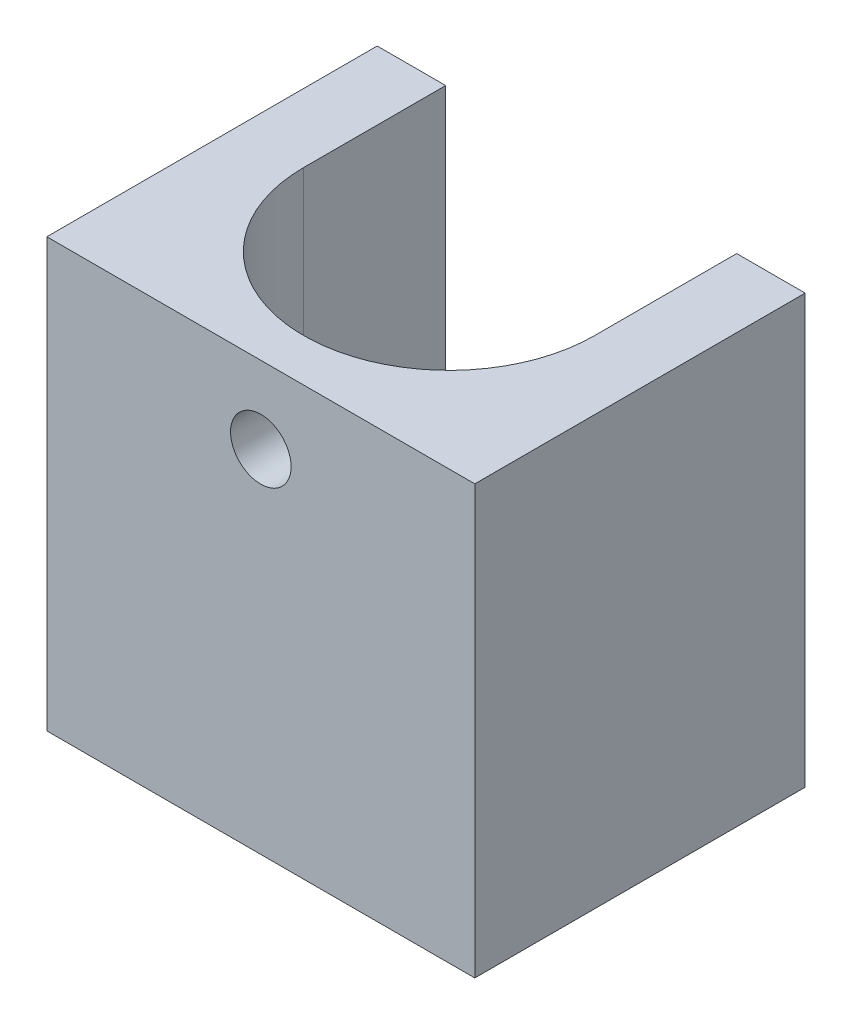
ISO-10303-21;
HEADER;
FILE_DESCRIPTION(('STEP AP214'),'2;1');
FILE_NAME('part.step','',(''),(''),'','','');
FILE_SCHEMA(('AUTOMOTIVE_DESIGN { 1 0 10303 214 1 1 1 1 }'));
ENDSEC;
DATA;
#1=APPLICATION_CONTEXT('core data for automotive mechanical design processes');
#2=APPLICATION_PROTOCOL_DEFINITION('international standard','automotive_design',2000,#1);
#3=PRODUCT_CONTEXT('',#1,'mechanical');
#4=PRODUCT('Part','Part','',(#3));
#5=PRODUCT_RELATED_PRODUCT_CATEGORY('part','',(#4));
#6=PRODUCT_DEFINITION_FORMATION('','',#4);
#7=PRODUCT_DEFINITION_CONTEXT('part definition',#1,'design');
#8=PRODUCT_DEFINITION('design','',#6,#7);
#9=PRODUCT_DEFINITION_SHAPE('','',#8);
#10=(LENGTH_UNIT() NAMED_UNIT(*) SI_UNIT(.MILLI.,.METRE.));
#11=(NAMED_UNIT(*) PLANE_ANGLE_UNIT() SI_UNIT($,.RADIAN.));
#12=(NAMED_UNIT(*) SI_UNIT($,.STERADIAN.) SOLID_ANGLE_UNIT());
#13=UNCERTAINTY_MEASURE_WITH_UNIT(LENGTH_MEASURE(1.E-05),#10,'distance_accuracy_value','');
#14=(GEOMETRIC_REPRESENTATION_CONTEXT(3) GLOBAL_UNCERTAINTY_ASSIGNED_CONTEXT((#13)) GLOBAL_UNIT_ASSIGNED_CONTEXT((#10,
#11,#12)) REPRESENTATION_CONTEXT('',''));
#15=CARTESIAN_POINT('',(0.,0.,0.));
#16=DIRECTION('',(0.,0.,1.));
#17=DIRECTION('',(1.,0.,0.));
#18=AXIS2_PLACEMENT_3D('',#15,#16,#17);
#19=CARTESIAN_POINT('',(15.875,31.75,1.5875));
#20=DIRECTION('',(-1.,0.,0.));
#21=DIRECTION('',(0.,0.,1.));
#22=AXIS2_PLACEMENT_3D('',#19,#20,#21);
#23=PLANE('',#22);
#24=DIRECTION('',(0.,0.,-1.));
#25=VECTOR('',#24,1.);
#26=CARTESIAN_POINT('',(15.875,0.,1.5875));
#27=LINE('',#26,#25);
#28=CARTESIAN_POINT('',(15.875,0.,1.5875));
#29=VERTEX_POINT('',#28);
#30=CARTESIAN_POINT('',(15.875,0.,-22.9235));
#31=VERTEX_POINT('',#30);
#32=EDGE_CURVE('E104',#29,#31,#27,.T.);
#33=ORIENTED_EDGE('',*,*,#32,.T.);
#34=DIRECTION('',(0.,1.,0.));
#35=VECTOR('',#34,1.);
#36=CARTESIAN_POINT('',(15.875,0.,-22.9235));
#37=LINE('',#36,#35);
#38=CARTESIAN_POINT('',(15.875,31.75,-22.9235));
#39=VERTEX_POINT('',#38);
#40=EDGE_CURVE('E108',#31,#39,#37,.T.);
#41=ORIENTED_EDGE('',*,*,#40,.T.);
#42=DIRECTION('',(0.,0.,-1.));
#43=VECTOR('',#42,1.);
#44=CARTESIAN_POINT('',(15.875,31.75,1.5875));
#45=LINE('',#44,#43);
#46=CARTESIAN_POINT('',(15.875,31.75,1.5875));
#47=VERTEX_POINT('',#46);
#48=EDGE_CURVE('E159',#47,#39,#45,.T.);
#49=ORIENTED_EDGE('',*,*,#48,.F.);
#50=DIRECTION('',(0.,-1.,0.));
#51=VECTOR('',#50,1.);
#52=CARTESIAN_POINT('',(15.875,31.75,1.5875));
#53=LINE('',#52,#51);
#54=EDGE_CURVE('E109',#47,#29,#53,.T.);
#55=ORIENTED_EDGE('',*,*,#54,.T.);
#56=EDGE_LOOP('',(#33,#41,#49,#55));
#57=FACE_BOUND('',#56,.T.);
#58=ADVANCED_FACE('F33',(#57),#23,.F.);
#59=CARTESIAN_POINT('',(-15.875,31.75,1.5875));
#60=DIRECTION('',(1.,0.,0.));
#61=DIRECTION('',(0.,0.,-1.));
#62=AXIS2_PLACEMENT_3D('',#59,#60,#61);
#63=PLANE('',#62);
#64=DIRECTION('',(0.,0.,1.));
#65=VECTOR('',#64,1.);
#66=CARTESIAN_POINT('',(-15.875,0.,1.5875));
#67=LINE('',#66,#65);
#68=CARTESIAN_POINT('',(-15.875,0.,-22.9235));
#69=VERTEX_POINT('',#68);
#70=CARTESIAN_POINT('',(-15.875,0.,1.5875));
#71=VERTEX_POINT('',#70);
#72=EDGE_CURVE('E61',#69,#71,#67,.T.);
#73=ORIENTED_EDGE('',*,*,#72,.T.);
#74=DIRECTION('',(0.,-1.,0.));
#75=VECTOR('',#74,1.);
#76=CARTESIAN_POINT('',(-15.875,31.75,1.5875));
#77=LINE('',#76,#75);
#78=CARTESIAN_POINT('',(-15.875,31.75,1.5875));
#79=VERTEX_POINT('',#78);
#80=EDGE_CURVE('E168',#79,#71,#77,.T.);
#81=ORIENTED_EDGE('',*,*,#80,.F.);
#82=DIRECTION('',(0.,0.,1.));
#83=VECTOR('',#82,1.);
#84=CARTESIAN_POINT('',(-15.875,31.75,1.5875));
#85=LINE('',#84,#83);
#86=CARTESIAN_POINT('',(-15.875,31.75,-22.9235));
#87=VERTEX_POINT('',#86);
#88=EDGE_CURVE('E161',#87,#79,#85,.T.);
#89=ORIENTED_EDGE('',*,*,#88,.F.);
#90=DIRECTION('',(0.,1.,0.));
#91=VECTOR('',#90,1.);
#92=CARTESIAN_POINT('',(-15.875,0.,-22.9235));
#93=LINE('',#92,#91);
#94=EDGE_CURVE('E145',#69,#87,#93,.T.);
#95=ORIENTED_EDGE('',*,*,#94,.F.);
#96=EDGE_LOOP('',(#73,#81,#89,#95));
#97=FACE_BOUND('',#96,.T.);
#98=ADVANCED_FACE('F207',(#97),#63,.F.);
#99=CARTESIAN_POINT('',(-15.875,31.75,1.5875));
#100=DIRECTION('',(0.,0.,-1.));
#101=DIRECTION('',(-1.,0.,0.));
#102=AXIS2_PLACEMENT_3D('',#99,#100,#101);
#103=PLANE('',#102);
#104=CARTESIAN_POINT('',(0.,26.035,1.5875));
#105=DIRECTION('',(0.,0.,1.));
#106=DIRECTION('',(1.,0.,0.));
#107=AXIS2_PLACEMENT_3D('',#104,#105,#106);
#108=CIRCLE('',#107,2.2463125);
#109=CARTESIAN_POINT('',(2.2463125,26.035,1.5875));
#110=VERTEX_POINT('',#109);
#111=EDGE_CURVE('E179',#110,#110,#108,.T.);
#112=ORIENTED_EDGE('',*,*,#111,.F.);
#113=EDGE_LOOP('',(#112));
#114=FACE_BOUND('',#113,.T.);
#115=DIRECTION('',(1.,0.,0.));
#116=VECTOR('',#115,1.);
#117=CARTESIAN_POINT('',(-15.875,0.,1.5875));
#118=LINE('',#117,#116);
#119=EDGE_CURVE('E162',#71,#29,#118,.T.);
#120=ORIENTED_EDGE('',*,*,#119,.T.);
#121=ORIENTED_EDGE('',*,*,#54,.F.);
#122=DIRECTION('',(1.,0.,0.));
#123=VECTOR('',#122,1.);
#124=CARTESIAN_POINT('',(-15.875,31.75,1.5875));
#125=LINE('',#124,#123);
#126=EDGE_CURVE('E50',#79,#47,#125,.T.);
#127=ORIENTED_EDGE('',*,*,#126,.F.);
#128=ORIENTED_EDGE('',*,*,#80,.T.);
#129=EDGE_LOOP('',(#120,#121,#127,#128));
#130=FACE_BOUND('',#129,.T.);
#131=ADVANCED_FACE('F211',(#114,#130),#103,.F.);
#132=CARTESIAN_POINT('',(0.,31.75,0.));
#133=DIRECTION('',(0.,-1.,0.));
#134=DIRECTION('',(0.,0.,-1.));
#135=AXIS2_PLACEMENT_3D('',#132,#133,#134);
#136=PLANE('',#135);
#137=ORIENTED_EDGE('',*,*,#48,.T.);
#138=DIRECTION('',(1.,0.,0.));
#139=VECTOR('',#138,1.);
#140=CARTESIAN_POINT('',(10.795,31.75,-22.9235));
#141=LINE('',#140,#139);
#142=CARTESIAN_POINT('',(10.795,31.75,-22.9235));
#143=VERTEX_POINT('',#142);
#144=EDGE_CURVE('E127',#143,#39,#141,.T.);
#145=ORIENTED_EDGE('',*,*,#144,.F.);
#146=DIRECTION('',(0.,0.,-1.));
#147=VECTOR('',#146,1.);
#148=CARTESIAN_POINT('',(10.795,31.75,-12.3825));
#149=LINE('',#148,#147);
#150=CARTESIAN_POINT('',(10.795,31.75,-12.3825));
#151=VERTEX_POINT('',#150);
#152=EDGE_CURVE('E122',#151,#143,#149,.T.);
#153=ORIENTED_EDGE('',*,*,#152,.F.);
#154=CARTESIAN_POINT('',(0.,31.75,-12.3825));
#155=DIRECTION('',(0.,-1.,0.));
#156=DIRECTION('',(0.,0.,1.));
#157=AXIS2_PLACEMENT_3D('',#154,#155,#156);
#158=CIRCLE('',#157,10.795);
#159=CARTESIAN_POINT('',(-10.795,31.75,-12.3825));
#160=VERTEX_POINT('',#159);
#161=EDGE_CURVE('E152',#151,#160,#158,.T.);
#162=ORIENTED_EDGE('',*,*,#161,.T.);
#163=DIRECTION('',(0.,0.,-1.));
#164=VECTOR('',#163,1.);
#165=CARTESIAN_POINT('',(-10.795,31.75,-12.3825));
#166=LINE('',#165,#164);
#167=CARTESIAN_POINT('',(-10.795,31.75,-22.9235));
#168=VERTEX_POINT('',#167);
#169=EDGE_CURVE('E70',#160,#168,#166,.T.);
#170=ORIENTED_EDGE('',*,*,#169,.T.);
#171=DIRECTION('',(-1.,0.,0.));
#172=VECTOR('',#171,1.);
#173=CARTESIAN_POINT('',(-10.795,31.75,-22.9235));
#174=LINE('',#173,#172);
#175=EDGE_CURVE('E138',#168,#87,#174,.T.);
#176=ORIENTED_EDGE('',*,*,#175,.T.);
#177=ORIENTED_EDGE('',*,*,#88,.T.);
#178=ORIENTED_EDGE('',*,*,#126,.T.);
#179=EDGE_LOOP('',(#137,#145,#153,#162,#170,#176,#177,#178));
#180=FACE_BOUND('',#179,.T.);
#181=ADVANCED_FACE('F216',(#180),#136,.F.);
#182=CARTESIAN_POINT('',(0.,0.,0.));
#183=DIRECTION('',(0.,-1.,0.));
#184=DIRECTION('',(0.,0.,-1.));
#185=AXIS2_PLACEMENT_3D('',#182,#183,#184);
#186=PLANE('',#185);
#187=ORIENTED_EDGE('',*,*,#32,.F.);
#188=ORIENTED_EDGE('',*,*,#119,.F.);
#189=ORIENTED_EDGE('',*,*,#72,.F.);
#190=DIRECTION('',(-1.,0.,0.));
#191=VECTOR('',#190,1.);
#192=CARTESIAN_POINT('',(-10.795,0.,-22.9235));
#193=LINE('',#192,#191);
#194=CARTESIAN_POINT('',(-10.795,0.,-22.9235));
#195=VERTEX_POINT('',#194);
#196=EDGE_CURVE('E137',#195,#69,#193,.T.);
#197=ORIENTED_EDGE('',*,*,#196,.F.);
#198=DIRECTION('',(0.,0.,-1.));
#199=VECTOR('',#198,1.);
#200=CARTESIAN_POINT('',(-10.795,0.,-12.3825));
#201=LINE('',#200,#199);
#202=CARTESIAN_POINT('',(-10.795,0.,-12.3825));
#203=VERTEX_POINT('',#202);
#204=EDGE_CURVE('E134',#203,#195,#201,.T.);
#205=ORIENTED_EDGE('',*,*,#204,.F.);
#206=CARTESIAN_POINT('',(0.,0.,-12.3825));
#207=DIRECTION('',(0.,-1.,0.));
#208=DIRECTION('',(0.,0.,1.));
#209=AXIS2_PLACEMENT_3D('',#206,#207,#208);
#210=CIRCLE('',#209,10.795);
#211=CARTESIAN_POINT('',(10.795,0.,-12.3825));
#212=VERTEX_POINT('',#211);
#213=EDGE_CURVE('E153',#212,#203,#210,.T.);
#214=ORIENTED_EDGE('',*,*,#213,.F.);
#215=DIRECTION('',(0.,0.,-1.));
#216=VECTOR('',#215,1.);
#217=CARTESIAN_POINT('',(10.795,0.,-12.3825));
#218=LINE('',#217,#216);
#219=CARTESIAN_POINT('',(10.795,0.,-22.9235));
#220=VERTEX_POINT('',#219);
#221=EDGE_CURVE('E118',#212,#220,#218,.T.);
#222=ORIENTED_EDGE('',*,*,#221,.T.);
#223=DIRECTION('',(1.,0.,0.));
#224=VECTOR('',#223,1.);
#225=CARTESIAN_POINT('',(10.795,0.,-22.9235));
#226=LINE('',#225,#224);
#227=EDGE_CURVE('E115',#220,#31,#226,.T.);
#228=ORIENTED_EDGE('',*,*,#227,.T.);
#229=EDGE_LOOP('',(#187,#188,#189,#197,#205,#214,#222,#228));
#230=FACE_BOUND('',#229,.T.);
#231=ADVANCED_FACE('F116',(#230),#186,.T.);
#232=CARTESIAN_POINT('',(0.,0.,-12.3825));
#233=DIRECTION('',(0.,1.,0.));
#234=DIRECTION('',(0.,0.,1.));
#235=AXIS2_PLACEMENT_3D('',#232,#233,#234);
#236=CYLINDRICAL_SURFACE('',#235,10.795);
#237=CARTESIAN_POINT('',(2.2463125,26.035,-1.82380191963309));
#238=CARTESIAN_POINT('',(2.24630801889067,25.9102980975695,-1.82379941329329));
#239=CARTESIAN_POINT('',(2.23589314924478,25.7855408644785,-1.82156872293391));
#240=CARTESIAN_POINT('',(2.19454813064661,25.5395635147346,-1.8129014673367));
#241=CARTESIAN_POINT('',(2.1636022352291,25.4183461876032,-1.80646167394358));
#242=CARTESIAN_POINT('',(2.08220283741837,25.183042666792,-1.79013641871801));
#243=CARTESIAN_POINT('',(2.03176957915482,25.0689492149962,-1.78025453369273));
#244=CARTESIAN_POINT('',(1.91288359262023,24.8508436450564,-1.75816280781251));
#245=CARTESIAN_POINT('',(1.84443160090354,24.7468311150708,-1.74595306211948));
#246=CARTESIAN_POINT('',(1.69033492995247,24.5502448268344,-1.72037265397318));
#247=CARTESIAN_POINT('',(1.60446707456114,24.4578477536264,-1.70698835249881));
#248=CARTESIAN_POINT('',(1.41845817790937,24.2886597597245,-1.68068667635262));
#249=CARTESIAN_POINT('',(1.31831609212669,24.2118699820989,-1.66776933593765));
#250=CARTESIAN_POINT('',(1.1054251735475,24.0753851114405,-1.64370929916088));
#251=CARTESIAN_POINT('',(0.992565939050443,24.0158587858257,-1.63258456648323));
#252=CARTESIAN_POINT('',(0.758176902795285,23.9166807740932,-1.61351677422));
#253=CARTESIAN_POINT('',(0.636647981773107,23.8770270724308,-1.60557339198817));
#254=CARTESIAN_POINT('',(0.390204505562318,23.8192723602949,-1.59385967214439));
#255=CARTESIAN_POINT('',(0.265362732107816,23.8008726982972,-1.59003156322937));
#256=CARTESIAN_POINT('',(0.0143095608319012,23.7852157504034,-1.58677992058946));
#257=CARTESIAN_POINT('',(-0.111901693227211,23.7879562663373,-1.58735592892143));
#258=CARTESIAN_POINT('',(-0.360056172064075,23.8142770864098,-1.59280311327523));
#259=CARTESIAN_POINT('',(-0.482035195868007,23.8375356073864,-1.59760796578486));
#260=CARTESIAN_POINT('',(-0.7203201860177,23.9037208189576,-1.61089784944001));
#261=CARTESIAN_POINT('',(-0.836625912248713,23.9466483412186,-1.61938303620067));
#262=CARTESIAN_POINT('',(-1.06117036160143,24.0512453969943,-1.63918838873128));
#263=CARTESIAN_POINT('',(-1.16934944824177,24.1130392664871,-1.65052727154309));
#264=CARTESIAN_POINT('',(-1.37392118868917,24.2535226202241,-1.67479282238073));
#265=CARTESIAN_POINT('',(-1.47031237805683,24.3322142003724,-1.68771968728641));
#266=CARTESIAN_POINT('',(-1.65048359436669,24.506018901898,-1.71402363328753));
#267=CARTESIAN_POINT('',(-1.73399158908954,24.6014136596622,-1.72740460761064));
#268=CARTESIAN_POINT('',(-1.88387163885177,24.804990076912,-1.75287867656877));
#269=CARTESIAN_POINT('',(-1.9502433139835,24.9131720198087,-1.7649717426477));
#270=CARTESIAN_POINT('',(-2.06407179950314,25.1396632265342,-1.78650958947656));
#271=CARTESIAN_POINT('',(-2.1114814779837,25.2579968484601,-1.7959477541608));
#272=CARTESIAN_POINT('',(-2.18566365162476,25.5011930481262,-1.81101254999985));
#273=CARTESIAN_POINT('',(-2.21243907997027,25.6260546952038,-1.81663972287821));
#274=CARTESIAN_POINT('',(-2.24417967112334,25.8762885495191,-1.82333603357067));
#275=CARTESIAN_POINT('',(-2.2495390441413,26.00160860603,-1.82448754493702));
#276=CARTESIAN_POINT('',(-2.23935891581652,26.2513517610689,-1.8223237268885));
#277=CARTESIAN_POINT('',(-2.22382070421666,26.375774914475,-1.81900867313804));
#278=CARTESIAN_POINT('',(-2.17262726406167,26.6188473340674,-1.8083626617025));
#279=CARTESIAN_POINT('',(-2.13718539471483,26.73754357291,-1.80107431991779));
#280=CARTESIAN_POINT('',(-2.04742004641362,26.9673132077645,-1.78334076561004));
#281=CARTESIAN_POINT('',(-1.99309490405002,27.0783859311957,-1.7728952749874));
#282=CARTESIAN_POINT('',(-1.8662228286045,27.2914725486292,-1.74984102708554));
#283=CARTESIAN_POINT('',(-1.79343084047027,27.3933374130543,-1.73720396444003));
#284=CARTESIAN_POINT('',(-1.63201548111779,27.583550422634,-1.71126682698481));
#285=CARTESIAN_POINT('',(-1.54339033924293,27.6718970539611,-1.69796667814074));
#286=CARTESIAN_POINT('',(-1.35104871272015,27.8340753294242,-1.67193284180096));
#287=CARTESIAN_POINT('',(-1.24710461027735,27.9076394892123,-1.65921234924829));
#288=CARTESIAN_POINT('',(-1.02810435483411,28.0362608135745,-1.63600599906754));
#289=CARTESIAN_POINT('',(-0.913048692409437,28.0913187947165,-1.62552004285008));
#290=CARTESIAN_POINT('',(-0.675770288897678,28.1809822718028,-1.60802030105356));
#291=CARTESIAN_POINT('',(-0.55359526321775,28.2157098210963,-1.60098583667968));
#292=CARTESIAN_POINT('',(-0.304983933026329,28.2641111679721,-1.59109266972791));
#293=CARTESIAN_POINT('',(-0.178548188494759,28.2777877213124,-1.58823342058062));
#294=CARTESIAN_POINT('',(0.072447311235902,28.283584851458,-1.58702716249068));
#295=CARTESIAN_POINT('',(0.196997574367888,28.2761063814831,-1.58859622207436));
#296=CARTESIAN_POINT('',(0.44302485000456,28.2406959175787,-1.5958924008333));
#297=CARTESIAN_POINT('',(0.564501907859699,28.2127642256542,-1.60161945861304));
#298=CARTESIAN_POINT('',(0.800659138641267,28.1374244151762,-1.61658413574063));
#299=CARTESIAN_POINT('',(0.915356487569953,28.0900681605784,-1.62581240190862));
#300=CARTESIAN_POINT('',(1.13523321946469,27.9772761133947,-1.64678936382296));
#301=CARTESIAN_POINT('',(1.24041177488728,27.9118387508768,-1.65853827841035));
#302=CARTESIAN_POINT('',(1.44023673028063,27.7634084751668,-1.68352478329805));
#303=CARTESIAN_POINT('',(1.53466879715641,27.6801307369438,-1.6967846607909));
#304=CARTESIAN_POINT('',(1.70835547317121,27.4989644647914,-1.72317156807893));
#305=CARTESIAN_POINT('',(1.78760645891321,27.4010724526453,-1.73629856545212));
#306=CARTESIAN_POINT('',(1.9295787452659,27.1920636526292,-1.7611055376211));
#307=CARTESIAN_POINT('',(1.99209313245796,27.0808039518948,-1.7727665306576));
#308=CARTESIAN_POINT('',(2.09743898593823,26.8491440268876,-1.79308662308683));
#309=CARTESIAN_POINT('',(2.14028780708636,26.7287519716953,-1.8017483676518));
#310=CARTESIAN_POINT('',(2.19705325228806,26.5126237087342,-1.81341360440769));
#311=CARTESIAN_POINT('',(2.21549143395745,26.4180958493269,-1.81728436787443));
#312=CARTESIAN_POINT('',(2.24012254109858,26.2273895944288,-1.82247944131964));
#313=CARTESIAN_POINT('',(2.24631595731052,26.1312112652407,-1.82380385334957));
#314=CARTESIAN_POINT('',(2.2463125,26.035,-1.82380191963309));
#315=B_SPLINE_CURVE_WITH_KNOTS('',3,(#237,#238,#239,#240,#241,#242,#243,#244,#245,#246,#247,
#248,#249,#250,#251,#252,#253,#254,#255,#256,#257,#258,#259,#260,#261,#262,#263,#264,#265,#266,
#267,#268,#269,#270,#271,#272,#273,#274,#275,#276,#277,#278,#279,#280,#281,#282,#283,#284,#285,
#286,#287,#288,#289,#290,#291,#292,#293,#294,#295,#296,#297,#298,#299,#300,#301,#302,#303,#304,
#305,#306,#307,#308,#309,#310,#311,#312,#313,#314),.UNSPECIFIED.,.T.,.F.,(4,2,2,2,2,2,2,2,2,2,2,
2,2,2,2,2,2,2,2,2,2,2,2,2,2,2,2,2,2,2,2,2,2,2,2,2,2,2,4),(0.,0.373753296085483,
0.747793577701312,1.12144633381024,1.49508381843318,1.87385194696024,2.25264780623135,
2.63503074340708,3.01737489023902,3.39427853592446,3.77114299144165,4.14220012346443,
4.51327294638318,4.88684608338592,5.26046558325139,5.64112923312094,6.02180132147794,
6.4034138136037,6.78497204901509,7.15947357952543,7.53395199786618,7.90449074626961,
8.275062143348,8.65083480411564,9.02664951470666,9.40874990639277,9.7908334360381,
10.1705989668277,10.5503147787837,10.9228822841683,11.2954442884651,11.6670179540863,
12.0386238925542,12.4166755978841,12.7948174238887,13.1774383411777,13.5597209431829,
13.8480944006048,14.136456300491),.UNSPECIFIED.);
#316=CARTESIAN_POINT('',(2.2463125,26.035,-1.82380191963309));
#317=VERTEX_POINT('',#316);
#318=EDGE_CURVE('E178',#317,#317,#315,.T.);
#319=ORIENTED_EDGE('',*,*,#318,.F.);
#320=EDGE_LOOP('',(#319));
#321=FACE_BOUND('',#320,.T.);
#322=CARTESIAN_POINT('',(2.1193125,5.715,-1.79757961639088));
#323=CARTESIAN_POINT('',(2.11930809385028,5.59719467515622,-1.79757728984988));
#324=CARTESIAN_POINT('',(2.10945655768061,5.4793333598827,-1.79559156243455));
#325=CARTESIAN_POINT('',(2.07034165830272,5.24694169832206,-1.78787433709972));
#326=CARTESIAN_POINT('',(2.04106248205011,5.13241414487019,-1.78213978789904));
#327=CARTESIAN_POINT('',(1.96403248188417,4.91008585927217,-1.76759885734378));
#328=CARTESIAN_POINT('',(1.91629967945218,4.80227868303725,-1.75879547377999));
#329=CARTESIAN_POINT('',(1.80376625114442,4.59620676811046,-1.73911235366955));
#330=CARTESIAN_POINT('',(1.73896669132506,4.49794143392237,-1.72823274682362));
#331=CARTESIAN_POINT('',(1.59319762671774,4.31239735175992,-1.70545736850968));
#332=CARTESIAN_POINT('',(1.51204014221707,4.22526758819777,-1.69355080108907));
#333=CARTESIAN_POINT('',(1.33626517441488,4.06576781913228,-1.67015819047538));
#334=CARTESIAN_POINT('',(1.24164676664298,3.99339882820191,-1.65867217623326));
#335=CARTESIAN_POINT('',(1.04065162915761,3.86489893444063,-1.63729863109269));
#336=CARTESIAN_POINT('',(0.934182956841164,3.80890927873157,-1.62742531130703));
#337=CARTESIAN_POINT('',(0.713123470809909,3.71566841060022,-1.61051075652896));
#338=CARTESIAN_POINT('',(0.598533390541954,3.67841550850991,-1.60346926617553));
#339=CARTESIAN_POINT('',(0.366029361890891,3.62416848139826,-1.59308802107732));
#340=CARTESIAN_POINT('',(0.248176165813367,3.60692290205761,-1.58970235783974));
#341=CARTESIAN_POINT('',(0.0112038828864438,3.5923958429376,-1.58685578102688));
#342=CARTESIAN_POINT('',(-0.10791508521234,3.59511250659248,-1.58739450246862));
#343=CARTESIAN_POINT('',(-0.342310715668997,3.62024145860486,-1.59230033132258));
#344=CARTESIAN_POINT('',(-0.457617674304333,3.64238292169544,-1.59661479439233));
#345=CARTESIAN_POINT('',(-0.682847088380457,3.70530376158774,-1.60852806027052));
#346=CARTESIAN_POINT('',(-0.792769333817491,3.74608386465651,-1.61612699105981));
#347=CARTESIAN_POINT('',(-1.00488552574402,3.84537742636665,-1.63384250532385));
#348=CARTESIAN_POINT('',(-1.10702818968978,3.90399763551965,-1.64397417701492));
#349=CARTESIAN_POINT('',(-1.30012757182361,4.0372285066385,-1.66563719572914));
#350=CARTESIAN_POINT('',(-1.39108304585319,4.11184094461844,-1.6771686981485));
#351=CARTESIAN_POINT('',(-1.56083259764691,4.27642603791314,-1.70058518339484));
#352=CARTESIAN_POINT('',(-1.63939668960676,4.36663568886108,-1.71247285003456));
#353=CARTESIAN_POINT('',(-1.78031779797202,4.55906905816476,-1.73507765824695));
#354=CARTESIAN_POINT('',(-1.84267452971317,4.66129298749215,-1.74579477925837));
#355=CARTESIAN_POINT('',(-1.9494860074442,4.87517581423588,-1.76484993691789));
#356=CARTESIAN_POINT('',(-1.99390466906206,4.9868531880944,-1.77318316839593));
#357=CARTESIAN_POINT('',(-2.06328119722622,5.21628710596851,-1.78645564918391));
#358=CARTESIAN_POINT('',(-2.08824149975014,5.33404288706422,-1.79139532332159));
#359=CARTESIAN_POINT('',(-2.11765143938992,5.5702096840036,-1.79723660852236));
#360=CARTESIAN_POINT('',(-2.12243268410358,5.6885778347537,-1.79820349828474));
#361=CARTESIAN_POINT('',(-2.11224008519222,5.92442060173808,-1.79616480161801));
#362=CARTESIAN_POINT('',(-2.09726731845174,6.04189526632938,-1.79315943173555));
#363=CARTESIAN_POINT('',(-2.04827724105719,6.27150912401374,-1.78357587894784));
#364=CARTESIAN_POINT('',(-2.01443610771127,6.38368741110981,-1.77703076399921));
#365=CARTESIAN_POINT('',(-1.92885786465738,6.60078180330274,-1.76113403470528));
#366=CARTESIAN_POINT('',(-1.87711932679164,6.70569732805147,-1.75178219639997));
#367=CARTESIAN_POINT('',(-1.75646052449165,6.90674202119175,-1.73117848168057));
#368=CARTESIAN_POINT('',(-1.68733216859196,7.00274395774455,-1.71990416880139));
#369=CARTESIAN_POINT('',(-1.5341343780211,7.18190578045954,-1.69678785862625));
#370=CARTESIAN_POINT('',(-1.45006346423458,7.2650643937784,-1.68494580521631));
#371=CARTESIAN_POINT('',(-1.26788064733063,7.41743074832957,-1.66181707942855));
#372=CARTESIAN_POINT('',(-1.16957993872691,7.48641463396162,-1.65054117464814));
#373=CARTESIAN_POINT('',(-0.962591801509153,7.60688791441411,-1.63000063633852));
#374=CARTESIAN_POINT('',(-0.853904798882631,7.65837802633679,-1.62073592037257));
#375=CARTESIAN_POINT('',(-0.629826775365758,7.74207320447115,-1.60530771817263));
#376=CARTESIAN_POINT('',(-0.514476830019518,7.77438494645098,-1.59912710845023));
#377=CARTESIAN_POINT('',(-0.279853612358368,7.8191449309233,-1.59049017994827));
#378=CARTESIAN_POINT('',(-0.160580796194261,7.831595474597,-1.58803342971222));
#379=CARTESIAN_POINT('',(0.0763616905667337,7.83619321523808,-1.58713074384043));
#380=CARTESIAN_POINT('',(0.194024698820941,7.82867742813435,-1.58861823177568));
#381=CARTESIAN_POINT('',(0.426376366187278,7.79429817508256,-1.59529739975443));
#382=CARTESIAN_POINT('',(0.541065059922878,7.76743493445961,-1.6004890366585));
#383=CARTESIAN_POINT('',(0.764012066648312,7.69527081185275,-1.61399185820536));
#384=CARTESIAN_POINT('',(0.872283465766293,7.65000904221702,-1.62229642236192));
#385=CARTESIAN_POINT('',(1.07974400351844,7.54237459720945,-1.64112947792718));
#386=CARTESIAN_POINT('',(1.17893245590297,7.48000063036927,-1.65165813717593));
#387=CARTESIAN_POINT('',(1.36708182843603,7.33876853625986,-1.67398753943401));
#388=CARTESIAN_POINT('',(1.4558591936052,7.25966858059968,-1.6858055552718));
#389=CARTESIAN_POINT('',(1.61899651353062,7.08772825072963,-1.70927721539059));
#390=CARTESIAN_POINT('',(1.6933530569951,6.99488463454891,-1.72093082017658));
#391=CARTESIAN_POINT('',(1.82626381754557,6.79694526753461,-1.7428861654641));
#392=CARTESIAN_POINT('',(1.88464725304236,6.69173309246947,-1.75317273357215));
#393=CARTESIAN_POINT('',(1.9828148303011,6.47282130650485,-1.77104486573165));
#394=CARTESIAN_POINT('',(2.02261605081103,6.35912960099114,-1.77863290843891));
#395=CARTESIAN_POINT('',(2.07465956792777,6.15679714152346,-1.78871378894458));
#396=CARTESIAN_POINT('',(2.09137483881205,6.0693198663422,-1.79201812954835));
#397=CARTESIAN_POINT('',(2.11370279003561,5.89290567421947,-1.79645188680561));
#398=CARTESIAN_POINT('',(2.11931582760741,5.80396880433569,-1.79758137343854));
#399=CARTESIAN_POINT('',(2.1193125,5.715,-1.79757961639088));
#400=B_SPLINE_CURVE_WITH_KNOTS('',3,(#322,#323,#324,#325,#326,#327,#328,#329,#330,#331,#332,
#333,#334,#335,#336,#337,#338,#339,#340,#341,#342,#343,#344,#345,#346,#347,#348,#349,#350,#351,
#352,#353,#354,#355,#356,#357,#358,#359,#360,#361,#362,#363,#364,#365,#366,#367,#368,#369,#370,
#371,#372,#373,#374,#375,#376,#377,#378,#379,#380,#381,#382,#383,#384,#385,#386,#387,#388,#389,
#390,#391,#392,#393,#394,#395,#396,#397,#398,#399),.UNSPECIFIED.,.T.,.F.,(4,2,2,2,2,2,2,2,2,2,2,
2,2,2,2,2,2,2,2,2,2,2,2,2,2,2,2,2,2,2,2,2,2,2,2,2,2,2,4),(0.,0.353090270947012,
0.706468291332051,1.05950207727705,1.4125138165786,1.76984079693553,2.12719232968091,
2.487540308633,2.84785578581444,3.20359196581148,3.55929506138763,3.91011629274036,
4.26095119524217,4.61392811361359,4.96694425210252,5.32589113303012,5.68484431803497,
6.04451602192453,6.4041426915448,6.7578359401491,7.11150990805939,7.46193556352166,
7.81238918832517,8.16725446159088,8.5221548814024,8.88228982367694,9.2424100015706,
9.60050784230974,9.95856418968688,10.3106153864177,10.6626624831416,11.0139650653208,
11.3652941678253,11.7221004959673,12.0789911251206,12.4395603865658,12.7997975964467,
13.0664666126123,13.3331270481264),.UNSPECIFIED.);
#401=CARTESIAN_POINT('',(2.1193125,5.715,-1.79757961639088));
#402=VERTEX_POINT('',#401);
#403=EDGE_CURVE('E170',#402,#402,#400,.T.);
#404=ORIENTED_EDGE('',*,*,#403,.F.);
#405=EDGE_LOOP('',(#404));
#406=FACE_BOUND('',#405,.T.);
#407=ORIENTED_EDGE('',*,*,#161,.F.);
#408=DIRECTION('',(0.,1.,0.));
#409=VECTOR('',#408,1.);
#410=CARTESIAN_POINT('',(10.795,0.,-12.3825));
#411=LINE('',#410,#409);
#412=EDGE_CURVE('E148',#212,#151,#411,.T.);
#413=ORIENTED_EDGE('',*,*,#412,.F.);
#414=ORIENTED_EDGE('',*,*,#213,.T.);
#415=DIRECTION('',(0.,1.,0.));
#416=VECTOR('',#415,1.);
#417=CARTESIAN_POINT('',(-10.795,0.,-12.3825));
#418=LINE('',#417,#416);
#419=EDGE_CURVE('E112',#203,#160,#418,.T.);
#420=ORIENTED_EDGE('',*,*,#419,.T.);
#421=EDGE_LOOP('',(#407,#413,#414,#420));
#422=FACE_BOUND('',#421,.T.);
#423=ADVANCED_FACE('F184',(#321,#406,#422),#236,.F.);
#424=CARTESIAN_POINT('',(-10.795,0.,-22.9235));
#425=DIRECTION('',(0.,0.,-1.));
#426=DIRECTION('',(-1.,0.,0.));
#427=AXIS2_PLACEMENT_3D('',#424,#425,#426);
#428=PLANE('',#427);
#429=ORIENTED_EDGE('',*,*,#175,.F.);
#430=DIRECTION('',(0.,1.,0.));
#431=VECTOR('',#430,1.);
#432=CARTESIAN_POINT('',(-10.795,0.,-22.9235));
#433=LINE('',#432,#431);
#434=EDGE_CURVE('E141',#195,#168,#433,.T.);
#435=ORIENTED_EDGE('',*,*,#434,.F.);
#436=ORIENTED_EDGE('',*,*,#196,.T.);
#437=ORIENTED_EDGE('',*,*,#94,.T.);
#438=EDGE_LOOP('',(#429,#435,#436,#437));
#439=FACE_BOUND('',#438,.T.);
#440=ADVANCED_FACE('F200',(#439),#428,.T.);
#441=CARTESIAN_POINT('',(-10.795,0.,-12.3825));
#442=DIRECTION('',(1.,0.,0.));
#443=DIRECTION('',(0.,0.,-1.));
#444=AXIS2_PLACEMENT_3D('',#441,#442,#443);
#445=PLANE('',#444);
#446=ORIENTED_EDGE('',*,*,#169,.F.);
#447=ORIENTED_EDGE('',*,*,#419,.F.);
#448=ORIENTED_EDGE('',*,*,#204,.T.);
#449=ORIENTED_EDGE('',*,*,#434,.T.);
#450=EDGE_LOOP('',(#446,#447,#448,#449));
#451=FACE_BOUND('',#450,.T.);
#452=ADVANCED_FACE('F196',(#451),#445,.T.);
#453=CARTESIAN_POINT('',(10.795,0.,-12.3825));
#454=DIRECTION('',(1.,0.,0.));
#455=DIRECTION('',(0.,0.,-1.));
#456=AXIS2_PLACEMENT_3D('',#453,#454,#455);
#457=PLANE('',#456);
#458=ORIENTED_EDGE('',*,*,#152,.T.);
#459=DIRECTION('',(0.,1.,0.));
#460=VECTOR('',#459,1.);
#461=CARTESIAN_POINT('',(10.795,0.,-22.9235));
#462=LINE('',#461,#460);
#463=EDGE_CURVE('E128',#220,#143,#462,.T.);
#464=ORIENTED_EDGE('',*,*,#463,.F.);
#465=ORIENTED_EDGE('',*,*,#221,.F.);
#466=ORIENTED_EDGE('',*,*,#412,.T.);
#467=EDGE_LOOP('',(#458,#464,#465,#466));
#468=FACE_BOUND('',#467,.T.);
#469=ADVANCED_FACE('F193',(#468),#457,.F.);
#470=CARTESIAN_POINT('',(10.795,0.,-22.9235));
#471=DIRECTION('',(0.,0.,1.));
#472=DIRECTION('',(1.,0.,0.));
#473=AXIS2_PLACEMENT_3D('',#470,#471,#472);
#474=PLANE('',#473);
#475=ORIENTED_EDGE('',*,*,#144,.T.);
#476=ORIENTED_EDGE('',*,*,#40,.F.);
#477=ORIENTED_EDGE('',*,*,#227,.F.);
#478=ORIENTED_EDGE('',*,*,#463,.T.);
#479=EDGE_LOOP('',(#475,#476,#477,#478));
#480=FACE_BOUND('',#479,.T.);
#481=ADVANCED_FACE('F125',(#480),#474,.F.);
#482=CARTESIAN_POINT('',(0.,26.035,-30.1625));
#483=DIRECTION('',(0.,0.,1.));
#484=DIRECTION('',(1.,0.,0.));
#485=AXIS2_PLACEMENT_3D('',#482,#483,#484);
#486=CYLINDRICAL_SURFACE('',#485,2.2463125);
#487=ORIENTED_EDGE('',*,*,#318,.T.);
#488=EDGE_LOOP('',(#487));
#489=FACE_BOUND('',#488,.T.);
#490=ORIENTED_EDGE('',*,*,#111,.T.);
#491=EDGE_LOOP('',(#490));
#492=FACE_BOUND('',#491,.T.);
#493=ADVANCED_FACE('F190',(#489,#492),#486,.F.);
#494=CARTESIAN_POINT('',(0.,5.715,-14.2875));
#495=DIRECTION('',(0.,0.,1.));
#496=DIRECTION('',(1.,0.,0.));
#497=AXIS2_PLACEMENT_3D('',#494,#495,#496);
#498=CYLINDRICAL_SURFACE('',#497,2.1193125);
#499=CARTESIAN_POINT('',(0.,5.715,-13.5255));
#500=DIRECTION('',(0.,0.,1.));
#501=DIRECTION('',(1.,0.,0.));
#502=AXIS2_PLACEMENT_3D('',#499,#500,#501);
#503=CIRCLE('',#502,2.1193125);
#504=CARTESIAN_POINT('',(2.1193125,5.715,-13.5255));
#505=VERTEX_POINT('',#504);
#506=EDGE_CURVE('E42',#505,#505,#503,.T.);
#507=ORIENTED_EDGE('',*,*,#506,.T.);
#508=EDGE_LOOP('',(#507));
#509=FACE_BOUND('',#508,.T.);
#510=ORIENTED_EDGE('',*,*,#403,.T.);
#511=EDGE_LOOP('',(#510));
#512=FACE_BOUND('',#511,.T.);
#513=ADVANCED_FACE('F243',(#509,#512),#498,.T.);
#514=CARTESIAN_POINT('',(0.,5.715,-14.2875));
#515=DIRECTION('',(0.,0.,1.));
#516=DIRECTION('',(1.,0.,0.));
#517=AXIS2_PLACEMENT_3D('',#514,#515,#516);
#518=PLANE('',#517);
#519=CARTESIAN_POINT('',(0.,5.715,-14.2875));
#520=DIRECTION('',(0.,0.,1.));
#521=DIRECTION('',(1.,0.,0.));
#522=AXIS2_PLACEMENT_3D('',#519,#520,#521);
#523=CIRCLE('',#522,1.3573125);
#524=CARTESIAN_POINT('',(1.3573125,5.715,-14.2875));
#525=VERTEX_POINT('',#524);
#526=EDGE_CURVE('E11',#525,#525,#523,.F.);
#527=ORIENTED_EDGE('',*,*,#526,.T.);
#528=EDGE_LOOP('',(#527));
#529=FACE_BOUND('',#528,.T.);
#530=ADVANCED_FACE('F245',(#529),#518,.F.);
#531=CARTESIAN_POINT('',(0.,5.715,-13.5255));
#532=DIRECTION('',(0.,0.,1.));
#533=DIRECTION('',(1.,0.,0.));
#534=AXIS2_PLACEMENT_3D('',#531,#532,#533);
#535=TOROIDAL_SURFACE('',#534,1.3573125,0.762);
#536=ORIENTED_EDGE('',*,*,#526,.F.);
#537=EDGE_LOOP('',(#536));
#538=FACE_BOUND('',#537,.T.);
#539=ORIENTED_EDGE('',*,*,#506,.F.);
#540=EDGE_LOOP('',(#539));
#541=FACE_BOUND('',#540,.T.);
#542=ADVANCED_FACE('F35',(#538,#541),#535,.T.);
#543=CLOSED_SHELL('',(#58,#98,#131,#181,#231,#423,#440,#452,#469,#481,#493,#513,#530,#542));
#544=MANIFOLD_SOLID_BREP('B2',#543);
#545=ADVANCED_BREP_SHAPE_REPRESENTATION('',(#18,#544),#14);
#546=SHAPE_DEFINITION_REPRESENTATION(#9,#545);
ENDSEC;
END-ISO-10303-21;
